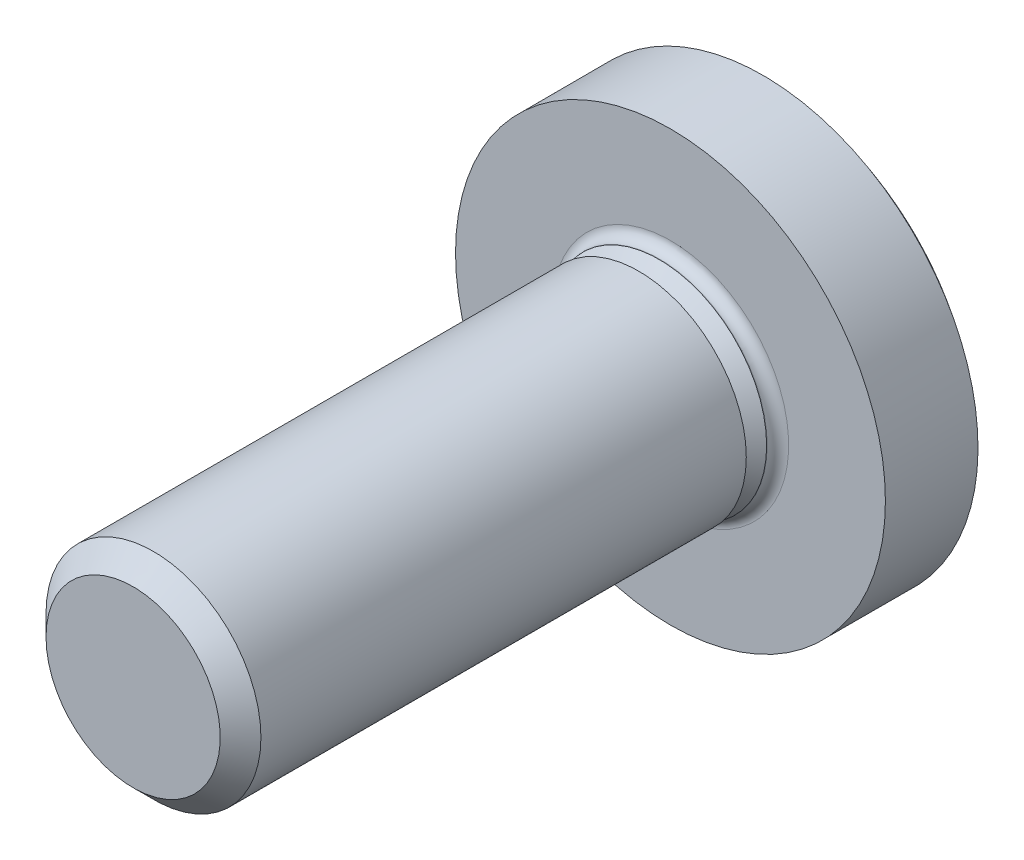
ISO-10303-21;
HEADER;
FILE_DESCRIPTION(('STEP AP214'),'2;1');
FILE_NAME('part.step','',(''),(''),'','','');
FILE_SCHEMA(('AUTOMOTIVE_DESIGN { 1 0 10303 214 1 1 1 1 }'));
ENDSEC;
DATA;
#1=APPLICATION_CONTEXT('core data for automotive mechanical design processes');
#2=APPLICATION_PROTOCOL_DEFINITION('international standard','automotive_design',2000,#1);
#3=PRODUCT_CONTEXT('',#1,'mechanical');
#4=PRODUCT('Part','Part','',(#3));
#5=PRODUCT_RELATED_PRODUCT_CATEGORY('part','',(#4));
#6=PRODUCT_DEFINITION_FORMATION('','',#4);
#7=PRODUCT_DEFINITION_CONTEXT('part definition',#1,'design');
#8=PRODUCT_DEFINITION('design','',#6,#7);
#9=PRODUCT_DEFINITION_SHAPE('','',#8);
#10=(LENGTH_UNIT() NAMED_UNIT(*) SI_UNIT(.MILLI.,.METRE.));
#11=(NAMED_UNIT(*) PLANE_ANGLE_UNIT() SI_UNIT($,.RADIAN.));
#12=(NAMED_UNIT(*) SI_UNIT($,.STERADIAN.) SOLID_ANGLE_UNIT());
#13=UNCERTAINTY_MEASURE_WITH_UNIT(LENGTH_MEASURE(1.E-05),#10,'distance_accuracy_value','');
#14=(GEOMETRIC_REPRESENTATION_CONTEXT(3) GLOBAL_UNCERTAINTY_ASSIGNED_CONTEXT((#13)) GLOBAL_UNIT_ASSIGNED_CONTEXT((#10,
#11,#12)) REPRESENTATION_CONTEXT('',''));
#15=CARTESIAN_POINT('',(0.,0.,0.));
#16=DIRECTION('',(0.,0.,1.));
#17=DIRECTION('',(1.,0.,0.));
#18=AXIS2_PLACEMENT_3D('',#15,#16,#17);
#19=CARTESIAN_POINT('',(0.,0.,6.5));
#20=DIRECTION('',(0.,0.,-1.));
#21=DIRECTION('',(0.,1.,0.));
#22=AXIS2_PLACEMENT_3D('',#19,#20,#21);
#23=SPHERICAL_SURFACE('',#22,6.5);
#24=CARTESIAN_POINT('',(0.,0.,1.3765246170202));
#25=DIRECTION('',(0.,0.,-1.));
#26=DIRECTION('',(-1.,0.,0.));
#27=AXIS2_PLACEMENT_3D('',#24,#25,#26);
#28=CIRCLE('',#27,4.);
#29=CARTESIAN_POINT('',(-4.,0.,1.3765246170202));
#30=VERTEX_POINT('',#29);
#31=EDGE_CURVE('E169',#30,#30,#28,.T.);
#32=ORIENTED_EDGE('',*,*,#31,.T.);
#33=EDGE_LOOP('',(#32));
#34=FACE_BOUND('',#33,.T.);
#35=CARTESIAN_POINT('',(-0.405545392562274,0.189108922281263,6.3801008200685));
#36=DIRECTION('',(-0.875426098065593,0.408217893676735,-0.258819045102521));
#37=DIRECTION('',(-0.422618261740699,-0.90630778703665,0.));
#38=AXIS2_PLACEMENT_3D('',#35,#36,#37);
#39=CIRCLE('',#38,6.48347090197349);
#40=CARTESIAN_POINT('',(0.92299563807694,-0.92299563807694,0.132413478861721));
#41=VERTEX_POINT('',#40);
#42=CARTESIAN_POINT('',(0.305622674506346,-2.10418012593627,0.35760463838069));
#43=VERTEX_POINT('',#42);
#44=EDGE_CURVE('E13',#41,#43,#39,.T.);
#45=ORIENTED_EDGE('',*,*,#44,.F.);
#46=CARTESIAN_POINT('',(-0.189108922281263,0.405545392562274,6.3801008200685));
#47=DIRECTION('',(-0.408217893676735,0.875426098065593,-0.258819045102521));
#48=DIRECTION('',(-0.90630778703665,-0.422618261740699,0.));
#49=AXIS2_PLACEMENT_3D('',#46,#47,#48);
#50=CIRCLE('',#49,6.48347090197349);
#51=CARTESIAN_POINT('',(2.10418012593627,-0.305622674506346,0.357604638380691));
#52=VERTEX_POINT('',#51);
#53=EDGE_CURVE('E33',#52,#41,#50,.T.);
#54=ORIENTED_EDGE('',*,*,#53,.F.);
#55=CARTESIAN_POINT('',(0.427627944162883,0.,6.61458256229943));
#56=DIRECTION('',(-0.965925826289068,0.,-0.258819045102521));
#57=DIRECTION('',(-0.258819045102521,0.,0.965925826289068));
#58=AXIS2_PLACEMENT_3D('',#55,#56,#57);
#59=CIRCLE('',#58,6.48490594980281);
#60=CARTESIAN_POINT('',(2.10418012593627,0.305622674506346,0.357604638380691));
#61=VERTEX_POINT('',#60);
#62=EDGE_CURVE('E233',#61,#52,#59,.T.);
#63=ORIENTED_EDGE('',*,*,#62,.F.);
#64=CARTESIAN_POINT('',(-0.189108922281263,-0.405545392562275,6.3801008200685));
#65=DIRECTION('',(-0.408217893676735,-0.875426098065593,-0.258819045102521));
#66=DIRECTION('',(0.90630778703665,-0.422618261740699,0.));
#67=AXIS2_PLACEMENT_3D('',#64,#65,#66);
#68=CIRCLE('',#67,6.48347090197349);
#69=CARTESIAN_POINT('',(0.922995638076941,0.922995638076939,0.132413478861721));
#70=VERTEX_POINT('',#69);
#71=EDGE_CURVE('E230',#70,#61,#68,.T.);
#72=ORIENTED_EDGE('',*,*,#71,.F.);
#73=CARTESIAN_POINT('',(-0.405545392562273,-0.189108922281263,6.3801008200685));
#74=DIRECTION('',(-0.875426098065593,-0.408217893676735,-0.258819045102521));
#75=DIRECTION('',(0.422618261740699,-0.90630778703665,0.));
#76=AXIS2_PLACEMENT_3D('',#73,#74,#75);
#77=CIRCLE('',#76,6.48347090197349);
#78=CARTESIAN_POINT('',(0.305622674506346,2.10418012593627,0.35760463838069));
#79=VERTEX_POINT('',#78);
#80=EDGE_CURVE('E227',#79,#70,#77,.T.);
#81=ORIENTED_EDGE('',*,*,#80,.F.);
#82=CARTESIAN_POINT('',(0.,0.427627944162883,6.61458256229943));
#83=DIRECTION('',(0.,-0.965925826289068,-0.258819045102521));
#84=DIRECTION('',(0.,0.258819045102521,-0.965925826289068));
#85=AXIS2_PLACEMENT_3D('',#82,#83,#84);
#86=CIRCLE('',#85,6.48490594980281);
#87=CARTESIAN_POINT('',(-0.305622674506345,2.10418012593627,0.35760463838069));
#88=VERTEX_POINT('',#87);
#89=EDGE_CURVE('E224',#88,#79,#86,.T.);
#90=ORIENTED_EDGE('',*,*,#89,.F.);
#91=CARTESIAN_POINT('',(0.405545392562275,-0.189108922281263,6.3801008200685));
#92=DIRECTION('',(0.875426098065593,-0.408217893676735,-0.258819045102521));
#93=DIRECTION('',(0.422618261740699,0.90630778703665,0.));
#94=AXIS2_PLACEMENT_3D('',#91,#92,#93);
#95=CIRCLE('',#94,6.48347090197349);
#96=CARTESIAN_POINT('',(-0.92299563807694,0.922995638076941,0.132413478861721));
#97=VERTEX_POINT('',#96);
#98=EDGE_CURVE('E221',#97,#88,#95,.T.);
#99=ORIENTED_EDGE('',*,*,#98,.F.);
#100=CARTESIAN_POINT('',(0.189108922281263,-0.405545392562273,6.3801008200685));
#101=DIRECTION('',(0.408217893676735,-0.875426098065593,-0.258819045102521));
#102=DIRECTION('',(0.90630778703665,0.422618261740699,0.));
#103=AXIS2_PLACEMENT_3D('',#100,#101,#102);
#104=CIRCLE('',#103,6.48347090197349);
#105=CARTESIAN_POINT('',(-2.10418012593627,0.305622674506346,0.35760463838069));
#106=VERTEX_POINT('',#105);
#107=EDGE_CURVE('E218',#106,#97,#104,.T.);
#108=ORIENTED_EDGE('',*,*,#107,.F.);
#109=CARTESIAN_POINT('',(-0.427627944162883,0.,6.61458256229943));
#110=DIRECTION('',(0.965925826289068,0.,-0.258819045102521));
#111=DIRECTION('',(-0.258819045102521,0.,-0.965925826289068));
#112=AXIS2_PLACEMENT_3D('',#109,#110,#111);
#113=CIRCLE('',#112,6.48490594980281);
#114=CARTESIAN_POINT('',(-2.10418012593627,-0.305622674506345,0.357604638380691));
#115=VERTEX_POINT('',#114);
#116=EDGE_CURVE('E215',#115,#106,#113,.T.);
#117=ORIENTED_EDGE('',*,*,#116,.F.);
#118=CARTESIAN_POINT('',(0.189108922281264,0.405545392562274,6.3801008200685));
#119=DIRECTION('',(0.408217893676735,0.875426098065593,-0.258819045102521));
#120=DIRECTION('',(-0.90630778703665,0.422618261740699,0.));
#121=AXIS2_PLACEMENT_3D('',#118,#119,#120);
#122=CIRCLE('',#121,6.48347090197349);
#123=CARTESIAN_POINT('',(-0.922995638076941,-0.92299563807694,0.132413478861721));
#124=VERTEX_POINT('',#123);
#125=EDGE_CURVE('E212',#124,#115,#122,.T.);
#126=ORIENTED_EDGE('',*,*,#125,.F.);
#127=CARTESIAN_POINT('',(0.405545392562273,0.189108922281263,6.3801008200685));
#128=DIRECTION('',(0.875426098065593,0.408217893676735,-0.258819045102521));
#129=DIRECTION('',(-0.422618261740699,0.90630778703665,0.));
#130=AXIS2_PLACEMENT_3D('',#127,#128,#129);
#131=CIRCLE('',#130,6.48347090197349);
#132=CARTESIAN_POINT('',(-0.305622674506346,-2.10418012593627,0.357604638380691));
#133=VERTEX_POINT('',#132);
#134=EDGE_CURVE('E209',#133,#124,#131,.T.);
#135=ORIENTED_EDGE('',*,*,#134,.F.);
#136=CARTESIAN_POINT('',(0.,-0.427627944162883,6.61458256229943));
#137=DIRECTION('',(0.,0.965925826289068,-0.258819045102521));
#138=DIRECTION('',(0.,0.258819045102521,0.965925826289068));
#139=AXIS2_PLACEMENT_3D('',#136,#137,#138);
#140=CIRCLE('',#139,6.48490594980281);
#141=EDGE_CURVE('E206',#43,#133,#140,.T.);
#142=ORIENTED_EDGE('',*,*,#141,.F.);
#143=EDGE_LOOP('',(#45,#54,#63,#72,#81,#90,#99,#108,#117,#126,#135,#142));
#144=FACE_BOUND('',#143,.T.);
#145=ADVANCED_FACE('F24',(#34,#144),#23,.T.);
#146=CARTESIAN_POINT('',(0.,0.,13.1));
#147=DIRECTION('',(0.,0.,-1.));
#148=DIRECTION('',(-1.,0.,0.));
#149=AXIS2_PLACEMENT_3D('',#146,#147,#148);
#150=PLANE('',#149);
#151=CARTESIAN_POINT('',(0.,0.,13.1));
#152=DIRECTION('',(0.,0.,-1.));
#153=DIRECTION('',(-1.,0.,0.));
#154=AXIS2_PLACEMENT_3D('',#151,#152,#153);
#155=CIRCLE('',#154,1.621125);
#156=CARTESIAN_POINT('',(-1.621125,0.,13.1));
#157=VERTEX_POINT('',#156);
#158=EDGE_CURVE('E202',#157,#157,#155,.T.);
#159=ORIENTED_EDGE('',*,*,#158,.F.);
#160=EDGE_LOOP('',(#159));
#161=FACE_BOUND('',#160,.T.);
#162=ADVANCED_FACE('F26',(#161),#150,.F.);
#163=CARTESIAN_POINT('',(0.,0.,13.1));
#164=DIRECTION('',(0.,0.,-1.));
#165=DIRECTION('',(-1.,0.,0.));
#166=AXIS2_PLACEMENT_3D('',#163,#164,#165);
#167=CONICAL_SURFACE('',#166,1.621125,0.78539816339745);
#168=CARTESIAN_POINT('',(0.,0.,12.721125));
#169=DIRECTION('',(0.,0.,-1.));
#170=DIRECTION('',(-1.,0.,0.));
#171=AXIS2_PLACEMENT_3D('',#168,#169,#170);
#172=CIRCLE('',#171,2.);
#173=CARTESIAN_POINT('',(-2.,0.,12.721125));
#174=VERTEX_POINT('',#173);
#175=EDGE_CURVE('E198',#174,#174,#172,.T.);
#176=ORIENTED_EDGE('',*,*,#175,.F.);
#177=EDGE_LOOP('',(#176));
#178=FACE_BOUND('',#177,.T.);
#179=ORIENTED_EDGE('',*,*,#158,.T.);
#180=EDGE_LOOP('',(#179));
#181=FACE_BOUND('',#180,.T.);
#182=ADVANCED_FACE('F254',(#178,#181),#167,.T.);
#183=CARTESIAN_POINT('',(0.,0.,0.));
#184=DIRECTION('',(0.,0.,-1.));
#185=DIRECTION('',(-1.,0.,0.));
#186=AXIS2_PLACEMENT_3D('',#183,#184,#185);
#187=CYLINDRICAL_SURFACE('',#186,2.);
#188=CARTESIAN_POINT('',(0.,0.,3.688875));
#189=DIRECTION('',(0.,0.,-1.));
#190=DIRECTION('',(-1.,0.,0.));
#191=AXIS2_PLACEMENT_3D('',#188,#189,#190);
#192=CIRCLE('',#191,2.);
#193=CARTESIAN_POINT('',(-2.,0.,3.688875));
#194=VERTEX_POINT('',#193);
#195=EDGE_CURVE('E194',#194,#194,#192,.T.);
#196=ORIENTED_EDGE('',*,*,#195,.F.);
#197=EDGE_LOOP('',(#196));
#198=FACE_BOUND('',#197,.T.);
#199=ORIENTED_EDGE('',*,*,#175,.T.);
#200=EDGE_LOOP('',(#199));
#201=FACE_BOUND('',#200,.T.);
#202=ADVANCED_FACE('F266',(#198,#201),#187,.T.);
#203=CARTESIAN_POINT('',(0.,2.,3.688875));
#204=DIRECTION('',(0.,0.,1.));
#205=DIRECTION('',(1.,0.,0.));
#206=AXIS2_PLACEMENT_3D('',#203,#204,#205);
#207=PLANE('',#206);
#208=CARTESIAN_POINT('',(0.,0.,3.688875));
#209=DIRECTION('',(0.,0.,-1.));
#210=DIRECTION('',(-1.,0.,0.));
#211=AXIS2_PLACEMENT_3D('',#208,#209,#210);
#212=CIRCLE('',#211,1.621125);
#213=CARTESIAN_POINT('',(-1.621125,0.,3.688875));
#214=VERTEX_POINT('',#213);
#215=EDGE_CURVE('E190',#214,#214,#212,.T.);
#216=ORIENTED_EDGE('',*,*,#215,.F.);
#217=EDGE_LOOP('',(#216));
#218=FACE_BOUND('',#217,.T.);
#219=ORIENTED_EDGE('',*,*,#195,.T.);
#220=EDGE_LOOP('',(#219));
#221=FACE_BOUND('',#220,.T.);
#222=ADVANCED_FACE('F276',(#218,#221),#207,.F.);
#223=CARTESIAN_POINT('',(0.,0.,3.688875));
#224=DIRECTION('',(0.,0.,-1.));
#225=DIRECTION('',(-1.,0.,0.));
#226=AXIS2_PLACEMENT_3D('',#223,#224,#225);
#227=CONICAL_SURFACE('',#226,1.621125,0.785398163397448);
#228=CARTESIAN_POINT('',(0.,0.,3.31));
#229=DIRECTION('',(0.,0.,-1.));
#230=DIRECTION('',(-1.,0.,0.));
#231=AXIS2_PLACEMENT_3D('',#228,#229,#230);
#232=CIRCLE('',#231,2.);
#233=CARTESIAN_POINT('',(-2.,0.,3.31));
#234=VERTEX_POINT('',#233);
#235=EDGE_CURVE('E186',#234,#234,#232,.T.);
#236=ORIENTED_EDGE('',*,*,#235,.F.);
#237=EDGE_LOOP('',(#236));
#238=FACE_BOUND('',#237,.T.);
#239=ORIENTED_EDGE('',*,*,#215,.T.);
#240=EDGE_LOOP('',(#239));
#241=FACE_BOUND('',#240,.T.);
#242=ADVANCED_FACE('F287',(#238,#241),#227,.T.);
#243=CARTESIAN_POINT('',(0.,0.,0.));
#244=DIRECTION('',(0.,0.,-1.));
#245=DIRECTION('',(-1.,0.,0.));
#246=AXIS2_PLACEMENT_3D('',#243,#244,#245);
#247=CYLINDRICAL_SURFACE('',#246,2.);
#248=CARTESIAN_POINT('',(0.,0.,3.3));
#249=DIRECTION('',(0.,0.,-1.));
#250=DIRECTION('',(-1.,0.,0.));
#251=AXIS2_PLACEMENT_3D('',#248,#249,#250);
#252=CIRCLE('',#251,2.);
#253=CARTESIAN_POINT('',(-2.,0.,3.3));
#254=VERTEX_POINT('',#253);
#255=EDGE_CURVE('E182',#254,#254,#252,.T.);
#256=ORIENTED_EDGE('',*,*,#255,.F.);
#257=EDGE_LOOP('',(#256));
#258=FACE_BOUND('',#257,.T.);
#259=ORIENTED_EDGE('',*,*,#235,.T.);
#260=EDGE_LOOP('',(#259));
#261=FACE_BOUND('',#260,.T.);
#262=ADVANCED_FACE('F298',(#258,#261),#247,.T.);
#263=CARTESIAN_POINT('',(0.,0.,3.3));
#264=DIRECTION('',(0.,0.,-1.));
#265=DIRECTION('',(-1.,0.,0.));
#266=AXIS2_PLACEMENT_3D('',#263,#264,#265);
#267=TOROIDAL_SURFACE('',#266,2.2,0.2);
#268=ORIENTED_EDGE('',*,*,#255,.T.);
#269=EDGE_LOOP('',(#268));
#270=FACE_BOUND('',#269,.T.);
#271=CARTESIAN_POINT('',(0.,0.,3.1));
#272=DIRECTION('',(0.,0.,-1.));
#273=DIRECTION('',(-1.,0.,0.));
#274=AXIS2_PLACEMENT_3D('',#271,#272,#273);
#275=CIRCLE('',#274,2.2);
#276=CARTESIAN_POINT('',(-2.2,0.,3.1));
#277=VERTEX_POINT('',#276);
#278=EDGE_CURVE('E178',#277,#277,#275,.T.);
#279=ORIENTED_EDGE('',*,*,#278,.F.);
#280=EDGE_LOOP('',(#279));
#281=FACE_BOUND('',#280,.T.);
#282=ADVANCED_FACE('F309',(#270,#281),#267,.F.);
#283=CARTESIAN_POINT('',(0.,2.2,3.1));
#284=DIRECTION('',(0.,0.,-1.));
#285=DIRECTION('',(-1.,0.,0.));
#286=AXIS2_PLACEMENT_3D('',#283,#284,#285);
#287=PLANE('',#286);
#288=CARTESIAN_POINT('',(0.,0.,3.1));
#289=DIRECTION('',(0.,0.,-1.));
#290=DIRECTION('',(-1.,0.,0.));
#291=AXIS2_PLACEMENT_3D('',#288,#289,#290);
#292=CIRCLE('',#291,4.);
#293=CARTESIAN_POINT('',(-4.,0.,3.1));
#294=VERTEX_POINT('',#293);
#295=EDGE_CURVE('E173',#294,#294,#292,.T.);
#296=ORIENTED_EDGE('',*,*,#295,.F.);
#297=EDGE_LOOP('',(#296));
#298=FACE_BOUND('',#297,.T.);
#299=ORIENTED_EDGE('',*,*,#278,.T.);
#300=EDGE_LOOP('',(#299));
#301=FACE_BOUND('',#300,.T.);
#302=ADVANCED_FACE('F320',(#298,#301),#287,.F.);
#303=CARTESIAN_POINT('',(0.,0.,0.));
#304=DIRECTION('',(0.,0.,-1.));
#305=DIRECTION('',(-1.,0.,0.));
#306=AXIS2_PLACEMENT_3D('',#303,#304,#305);
#307=CYLINDRICAL_SURFACE('',#306,4.);
#308=ORIENTED_EDGE('',*,*,#31,.F.);
#309=EDGE_LOOP('',(#308));
#310=FACE_BOUND('',#309,.T.);
#311=ORIENTED_EDGE('',*,*,#295,.T.);
#312=EDGE_LOOP('',(#311));
#313=FACE_BOUND('',#312,.T.);
#314=ADVANCED_FACE('F331',(#310,#313),#307,.T.);
#315=CARTESIAN_POINT('',(0.366666666666667,-2.2,0.));
#316=DIRECTION('',(-0.875426098065593,0.408217893676735,-0.258819045102521));
#317=DIRECTION('',(-0.422618261740699,-0.90630778703665,0.));
#318=AXIS2_PLACEMENT_3D('',#315,#316,#317);
#319=PLANE('',#318);
#320=ORIENTED_EDGE('',*,*,#44,.T.);
#321=DIRECTION('',(0.162689201767992,-0.255370893567974,-0.953057149569945));
#322=VECTOR('',#321,1.);
#323=CARTESIAN_POINT('',(0.366666666666667,-2.2,0.));
#324=LINE('',#323,#322);
#325=CARTESIAN_POINT('',(0.0423319890466869,-1.69089653438087,1.9));
#326=VERTEX_POINT('',#325);
#327=EDGE_CURVE('E40',#326,#43,#324,.T.);
#328=ORIENTED_EDGE('',*,*,#327,.F.);
#329=DIRECTION('',(0.422618261740699,0.90630778703665,0.));
#330=VECTOR('',#329,1.);
#331=CARTESIAN_POINT('',(0.149047069992156,-1.46204530477057,1.9));
#332=LINE('',#331,#330);
#333=CARTESIAN_POINT('',(0.566600049829658,-0.566600049829659,1.9));
#334=VERTEX_POINT('',#333);
#335=EDGE_CURVE('E126',#326,#334,#332,.T.);
#336=ORIENTED_EDGE('',*,*,#335,.T.);
#337=DIRECTION('',(0.193899607686987,-0.193899607686987,-0.961668281829896));
#338=VECTOR('',#337,1.);
#339=CARTESIAN_POINT('',(0.974781670177971,-0.974781670177972,-0.12442553751102));
#340=LINE('',#339,#338);
#341=EDGE_CURVE('E174',#334,#41,#340,.T.);
#342=ORIENTED_EDGE('',*,*,#341,.T.);
#343=EDGE_LOOP('',(#320,#328,#336,#342));
#344=FACE_BOUND('',#343,.T.);
#345=ADVANCED_FACE('F125',(#344),#319,.T.);
#346=CARTESIAN_POINT('',(0.949693951922647,-0.949693951922649,0.));
#347=DIRECTION('',(-0.408217893676735,0.875426098065593,-0.258819045102521));
#348=DIRECTION('',(-0.90630778703665,-0.422618261740699,0.));
#349=AXIS2_PLACEMENT_3D('',#346,#347,#348);
#350=PLANE('',#349);
#351=ORIENTED_EDGE('',*,*,#53,.T.);
#352=ORIENTED_EDGE('',*,*,#341,.F.);
#353=DIRECTION('',(0.90630778703665,0.422618261740699,0.));
#354=VECTOR('',#353,1.);
#355=CARTESIAN_POINT('',(0.177234242228863,-0.748164307737616,1.9));
#356=LINE('',#355,#354);
#357=CARTESIAN_POINT('',(1.69089653438087,-0.0423319890466872,1.9));
#358=VERTEX_POINT('',#357);
#359=EDGE_CURVE('E133',#334,#358,#356,.T.);
#360=ORIENTED_EDGE('',*,*,#359,.T.);
#361=DIRECTION('',(0.255370893567974,-0.162689201767992,-0.953057149569945));
#362=VECTOR('',#361,1.);
#363=CARTESIAN_POINT('',(2.2,-0.366666666666667,0.));
#364=LINE('',#363,#362);
#365=EDGE_CURVE('E576',#358,#52,#364,.T.);
#366=ORIENTED_EDGE('',*,*,#365,.T.);
#367=EDGE_LOOP('',(#351,#352,#360,#366));
#368=FACE_BOUND('',#367,.T.);
#369=ADVANCED_FACE('F351',(#368),#350,.T.);
#370=CARTESIAN_POINT('',(2.2,-0.366666666666667,0.));
#371=DIRECTION('',(-0.965925826289068,0.,-0.258819045102521));
#372=DIRECTION('',(-0.258819045102521,0.,0.965925826289068));
#373=AXIS2_PLACEMENT_3D('',#370,#371,#372);
#374=PLANE('',#373);
#375=ORIENTED_EDGE('',*,*,#62,.T.);
#376=ORIENTED_EDGE('',*,*,#365,.F.);
#377=DIRECTION('',(0.,1.,0.));
#378=VECTOR('',#377,1.);
#379=CARTESIAN_POINT('',(1.69089653438087,-1.67720172645669,1.9));
#380=LINE('',#379,#378);
#381=CARTESIAN_POINT('',(1.69089653438087,0.0423319890466869,1.9));
#382=VERTEX_POINT('',#381);
#383=EDGE_CURVE('E140',#358,#382,#380,.T.);
#384=ORIENTED_EDGE('',*,*,#383,.T.);
#385=DIRECTION('',(0.255370893567974,0.162689201767992,-0.953057149569945));
#386=VECTOR('',#385,1.);
#387=CARTESIAN_POINT('',(2.2,0.366666666666667,0.));
#388=LINE('',#387,#386);
#389=EDGE_CURVE('E573',#382,#61,#388,.T.);
#390=ORIENTED_EDGE('',*,*,#389,.T.);
#391=EDGE_LOOP('',(#375,#376,#384,#390));
#392=FACE_BOUND('',#391,.T.);
#393=ADVANCED_FACE('F368',(#392),#374,.T.);
#394=CARTESIAN_POINT('',(2.2,0.366666666666667,0.));
#395=DIRECTION('',(-0.408217893676735,-0.875426098065593,-0.258819045102521));
#396=DIRECTION('',(0.90630778703665,-0.422618261740699,0.));
#397=AXIS2_PLACEMENT_3D('',#394,#395,#396);
#398=PLANE('',#397);
#399=ORIENTED_EDGE('',*,*,#71,.T.);
#400=ORIENTED_EDGE('',*,*,#389,.F.);
#401=DIRECTION('',(-0.90630778703665,0.422618261740699,0.));
#402=VECTOR('',#401,1.);
#403=CARTESIAN_POINT('',(1.46204530477057,0.149047069992157,1.9));
#404=LINE('',#403,#402);
#405=CARTESIAN_POINT('',(0.566600049829659,0.566600049829658,1.9));
#406=VERTEX_POINT('',#405);
#407=EDGE_CURVE('E146',#382,#406,#404,.T.);
#408=ORIENTED_EDGE('',*,*,#407,.T.);
#409=DIRECTION('',(0.193899607686987,0.193899607686987,-0.961668281829896));
#410=VECTOR('',#409,1.);
#411=CARTESIAN_POINT('',(0.974781670177972,0.97478167017797,-0.12442553751102));
#412=LINE('',#411,#410);
#413=EDGE_CURVE('E570',#406,#70,#412,.T.);
#414=ORIENTED_EDGE('',*,*,#413,.T.);
#415=EDGE_LOOP('',(#399,#400,#408,#414));
#416=FACE_BOUND('',#415,.T.);
#417=ADVANCED_FACE('F378',(#416),#398,.T.);
#418=CARTESIAN_POINT('',(0.949693951922649,0.949693951922647,0.));
#419=DIRECTION('',(-0.875426098065593,-0.408217893676735,-0.258819045102521));
#420=DIRECTION('',(0.422618261740699,-0.90630778703665,0.));
#421=AXIS2_PLACEMENT_3D('',#418,#419,#420);
#422=PLANE('',#421);
#423=ORIENTED_EDGE('',*,*,#80,.T.);
#424=ORIENTED_EDGE('',*,*,#413,.F.);
#425=DIRECTION('',(-0.422618261740699,0.90630778703665,0.));
#426=VECTOR('',#425,1.);
#427=CARTESIAN_POINT('',(1.43385813253386,-1.29324091039736,1.9));
#428=LINE('',#427,#426);
#429=CARTESIAN_POINT('',(0.0423319890466871,1.69089653438087,1.9));
#430=VERTEX_POINT('',#429);
#431=EDGE_CURVE('E149',#406,#430,#428,.T.);
#432=ORIENTED_EDGE('',*,*,#431,.T.);
#433=DIRECTION('',(0.162689201767992,0.255370893567974,-0.953057149569945));
#434=VECTOR('',#433,1.);
#435=CARTESIAN_POINT('',(0.366666666666667,2.2,0.));
#436=LINE('',#435,#434);
#437=EDGE_CURVE('E567',#430,#79,#436,.T.);
#438=ORIENTED_EDGE('',*,*,#437,.T.);
#439=EDGE_LOOP('',(#423,#424,#432,#438));
#440=FACE_BOUND('',#439,.T.);
#441=ADVANCED_FACE('F390',(#440),#422,.T.);
#442=CARTESIAN_POINT('',(0.366666666666667,2.2,0.));
#443=DIRECTION('',(0.,-0.965925826289068,-0.258819045102521));
#444=DIRECTION('',(0.,0.258819045102521,-0.965925826289068));
#445=AXIS2_PLACEMENT_3D('',#442,#443,#444);
#446=PLANE('',#445);
#447=ORIENTED_EDGE('',*,*,#89,.T.);
#448=ORIENTED_EDGE('',*,*,#437,.F.);
#449=DIRECTION('',(-1.,0.,0.));
#450=VECTOR('',#449,1.);
#451=CARTESIAN_POINT('',(0.610451505290122,1.69089653438087,1.9));
#452=LINE('',#451,#450);
#453=CARTESIAN_POINT('',(-0.0423319890466866,1.69089653438087,1.9));
#454=VERTEX_POINT('',#453);
#455=EDGE_CURVE('E152',#430,#454,#452,.T.);
#456=ORIENTED_EDGE('',*,*,#455,.T.);
#457=DIRECTION('',(-0.162689201767992,0.255370893567974,-0.953057149569945));
#458=VECTOR('',#457,1.);
#459=CARTESIAN_POINT('',(-0.366666666666667,2.2,0.));
#460=LINE('',#459,#458);
#461=EDGE_CURVE('E564',#454,#88,#460,.T.);
#462=ORIENTED_EDGE('',*,*,#461,.T.);
#463=EDGE_LOOP('',(#447,#448,#456,#462));
#464=FACE_BOUND('',#463,.T.);
#465=ADVANCED_FACE('F402',(#464),#446,.T.);
#466=CARTESIAN_POINT('',(-0.366666666666667,2.2,0.));
#467=DIRECTION('',(0.875426098065593,-0.408217893676735,-0.258819045102521));
#468=DIRECTION('',(0.422618261740699,0.90630778703665,0.));
#469=AXIS2_PLACEMENT_3D('',#466,#467,#468);
#470=PLANE('',#469);
#471=ORIENTED_EDGE('',*,*,#98,.T.);
#472=ORIENTED_EDGE('',*,*,#461,.F.);
#473=DIRECTION('',(-0.422618261740699,-0.90630778703665,0.));
#474=VECTOR('',#473,1.);
#475=CARTESIAN_POINT('',(-1.21579729115873,-0.825607926976247,1.9));
#476=LINE('',#475,#474);
#477=CARTESIAN_POINT('',(-0.566600049829658,0.56660004982966,1.9));
#478=VERTEX_POINT('',#477);
#479=EDGE_CURVE('E155',#454,#478,#476,.T.);
#480=ORIENTED_EDGE('',*,*,#479,.T.);
#481=DIRECTION('',(-0.193899607686987,0.193899607686987,-0.961668281829896));
#482=VECTOR('',#481,1.);
#483=CARTESIAN_POINT('',(-0.97478167017797,0.974781670177972,-0.12442553751102));
#484=LINE('',#483,#482);
#485=EDGE_CURVE('E561',#478,#97,#484,.T.);
#486=ORIENTED_EDGE('',*,*,#485,.T.);
#487=EDGE_LOOP('',(#471,#472,#480,#486));
#488=FACE_BOUND('',#487,.T.);
#489=ADVANCED_FACE('F414',(#488),#470,.T.);
#490=CARTESIAN_POINT('',(-0.949693951922647,0.949693951922649,0.));
#491=DIRECTION('',(0.408217893676735,-0.875426098065593,-0.258819045102521));
#492=DIRECTION('',(0.90630778703665,0.422618261740699,0.));
#493=AXIS2_PLACEMENT_3D('',#490,#491,#492);
#494=PLANE('',#493);
#495=ORIENTED_EDGE('',*,*,#107,.T.);
#496=ORIENTED_EDGE('',*,*,#485,.F.);
#497=DIRECTION('',(-0.90630778703665,-0.422618261740699,0.));
#498=VECTOR('',#497,1.);
#499=CARTESIAN_POINT('',(-0.459203135565461,0.616680053413271,1.9));
#500=LINE('',#499,#498);
#501=CARTESIAN_POINT('',(-1.69089653438087,0.0423319890466875,1.9));
#502=VERTEX_POINT('',#501);
#503=EDGE_CURVE('E158',#478,#502,#500,.T.);
#504=ORIENTED_EDGE('',*,*,#503,.T.);
#505=DIRECTION('',(-0.255370893567974,0.162689201767992,-0.953057149569945));
#506=VECTOR('',#505,1.);
#507=CARTESIAN_POINT('',(-2.2,0.366666666666668,0.));
#508=LINE('',#507,#506);
#509=EDGE_CURVE('E558',#502,#106,#508,.T.);
#510=ORIENTED_EDGE('',*,*,#509,.T.);
#511=EDGE_LOOP('',(#495,#496,#504,#510));
#512=FACE_BOUND('',#511,.T.);
#513=ADVANCED_FACE('F426',(#512),#494,.T.);
#514=CARTESIAN_POINT('',(-2.2,0.366666666666668,0.));
#515=DIRECTION('',(0.965925826289068,0.,-0.258819045102521));
#516=DIRECTION('',(-0.258819045102521,0.,-0.965925826289068));
#517=AXIS2_PLACEMENT_3D('',#514,#515,#516);
#518=PLANE('',#517);
#519=ORIENTED_EDGE('',*,*,#116,.T.);
#520=ORIENTED_EDGE('',*,*,#509,.F.);
#521=DIRECTION('',(0.,-1.,0.));
#522=VECTOR('',#521,1.);
#523=CARTESIAN_POINT('',(-1.69089653438087,-1.67720172645669,1.9));
#524=LINE('',#523,#522);
#525=CARTESIAN_POINT('',(-1.69089653438087,-0.0423319890466864,1.9));
#526=VERTEX_POINT('',#525);
#527=EDGE_CURVE('E161',#502,#526,#524,.T.);
#528=ORIENTED_EDGE('',*,*,#527,.T.);
#529=DIRECTION('',(-0.255370893567974,-0.162689201767992,-0.953057149569945));
#530=VECTOR('',#529,1.);
#531=CARTESIAN_POINT('',(-2.2,-0.366666666666667,0.));
#532=LINE('',#531,#530);
#533=EDGE_CURVE('E553',#526,#115,#532,.T.);
#534=ORIENTED_EDGE('',*,*,#533,.T.);
#535=EDGE_LOOP('',(#519,#520,#528,#534));
#536=FACE_BOUND('',#535,.T.);
#537=ADVANCED_FACE('F438',(#536),#518,.T.);
#538=CARTESIAN_POINT('',(-2.2,-0.366666666666667,0.));
#539=DIRECTION('',(0.408217893676735,0.875426098065593,-0.258819045102521));
#540=DIRECTION('',(-0.90630778703665,0.422618261740699,0.));
#541=AXIS2_PLACEMENT_3D('',#538,#539,#540);
#542=PLANE('',#541);
#543=ORIENTED_EDGE('',*,*,#125,.T.);
#544=ORIENTED_EDGE('',*,*,#533,.F.);
#545=DIRECTION('',(0.90630778703665,-0.422618261740699,0.));
#546=VECTOR('',#545,1.);
#547=CARTESIAN_POINT('',(0.825607926976246,-1.21579729115873,1.9));
#548=LINE('',#547,#546);
#549=CARTESIAN_POINT('',(-0.56660004982966,-0.566600049829658,1.9));
#550=VERTEX_POINT('',#549);
#551=EDGE_CURVE('E164',#526,#550,#548,.T.);
#552=ORIENTED_EDGE('',*,*,#551,.T.);
#553=DIRECTION('',(-0.193899607686987,-0.193899607686987,-0.961668281829896));
#554=VECTOR('',#553,1.);
#555=CARTESIAN_POINT('',(-0.974781670177972,-0.97478167017797,-0.12442553751102));
#556=LINE('',#555,#554);
#557=EDGE_CURVE('E550',#550,#124,#556,.T.);
#558=ORIENTED_EDGE('',*,*,#557,.T.);
#559=EDGE_LOOP('',(#543,#544,#552,#558));
#560=FACE_BOUND('',#559,.T.);
#561=ADVANCED_FACE('F450',(#560),#542,.T.);
#562=CARTESIAN_POINT('',(-0.949693951922649,-0.949693951922647,0.));
#563=DIRECTION('',(0.875426098065593,0.408217893676735,-0.258819045102521));
#564=DIRECTION('',(-0.422618261740699,0.90630778703665,0.));
#565=AXIS2_PLACEMENT_3D('',#562,#563,#564);
#566=PLANE('',#565);
#567=ORIENTED_EDGE('',*,*,#134,.T.);
#568=ORIENTED_EDGE('',*,*,#557,.F.);
#569=DIRECTION('',(0.422618261740699,-0.90630778703665,0.));
#570=VECTOR('',#569,1.);
#571=CARTESIAN_POINT('',(0.0690137713829782,-1.92967828819168,1.9));
#572=LINE('',#571,#570);
#573=CARTESIAN_POINT('',(-0.0423319890466871,-1.69089653438087,1.9));
#574=VERTEX_POINT('',#573);
#575=EDGE_CURVE('E121',#550,#574,#572,.T.);
#576=ORIENTED_EDGE('',*,*,#575,.T.);
#577=DIRECTION('',(-0.162689201767992,-0.255370893567974,-0.953057149569945));
#578=VECTOR('',#577,1.);
#579=CARTESIAN_POINT('',(-0.366666666666667,-2.2,0.));
#580=LINE('',#579,#578);
#581=EDGE_CURVE('E116',#574,#133,#580,.T.);
#582=ORIENTED_EDGE('',*,*,#581,.T.);
#583=EDGE_LOOP('',(#567,#568,#576,#582));
#584=FACE_BOUND('',#583,.T.);
#585=ADVANCED_FACE('F462',(#584),#566,.T.);
#586=CARTESIAN_POINT('',(-0.366666666666667,-2.2,0.));
#587=DIRECTION('',(0.,0.965925826289068,-0.258819045102521));
#588=DIRECTION('',(0.,0.258819045102521,0.965925826289068));
#589=AXIS2_PLACEMENT_3D('',#586,#587,#588);
#590=PLANE('',#589);
#591=ORIENTED_EDGE('',*,*,#141,.T.);
#592=ORIENTED_EDGE('',*,*,#581,.F.);
#593=DIRECTION('',(1.,0.,0.));
#594=VECTOR('',#593,1.);
#595=CARTESIAN_POINT('',(0.610451505290122,-1.69089653438087,1.9));
#596=LINE('',#595,#594);
#597=EDGE_CURVE('E113',#574,#326,#596,.T.);
#598=ORIENTED_EDGE('',*,*,#597,.T.);
#599=ORIENTED_EDGE('',*,*,#327,.T.);
#600=EDGE_LOOP('',(#591,#592,#598,#599));
#601=FACE_BOUND('',#600,.T.);
#602=ADVANCED_FACE('F114',(#601),#590,.T.);
#603=CARTESIAN_POINT('',(0.610451505290122,-1.67720172645669,1.9));
#604=DIRECTION('',(0.,0.,-1.));
#605=DIRECTION('',(-1.,0.,0.));
#606=AXIS2_PLACEMENT_3D('',#603,#604,#605);
#607=PLANE('',#606);
#608=ORIENTED_EDGE('',*,*,#335,.F.);
#609=ORIENTED_EDGE('',*,*,#597,.F.);
#610=ORIENTED_EDGE('',*,*,#575,.F.);
#611=ORIENTED_EDGE('',*,*,#551,.F.);
#612=ORIENTED_EDGE('',*,*,#527,.F.);
#613=ORIENTED_EDGE('',*,*,#503,.F.);
#614=ORIENTED_EDGE('',*,*,#479,.F.);
#615=ORIENTED_EDGE('',*,*,#455,.F.);
#616=ORIENTED_EDGE('',*,*,#431,.F.);
#617=ORIENTED_EDGE('',*,*,#407,.F.);
#618=ORIENTED_EDGE('',*,*,#383,.F.);
#619=ORIENTED_EDGE('',*,*,#359,.F.);
#620=EDGE_LOOP('',(#608,#609,#610,#611,#612,#613,#614,#615,#616,#617,#618,#619));
#621=FACE_BOUND('',#620,.T.);
#622=ADVANCED_FACE('F131',(#621),#607,.T.);
#623=CLOSED_SHELL('',(#145,#162,#182,#202,#222,#242,#262,#282,#302,#314,#345,#369,#393,#417,
#441,#465,#489,#513,#537,#561,#585,#602,#622));
#624=MANIFOLD_SOLID_BREP('B1',#623);
#625=ADVANCED_BREP_SHAPE_REPRESENTATION('',(#18,#624),#14);
#626=SHAPE_DEFINITION_REPRESENTATION(#9,#625);
ENDSEC;
END-ISO-10303-21;
